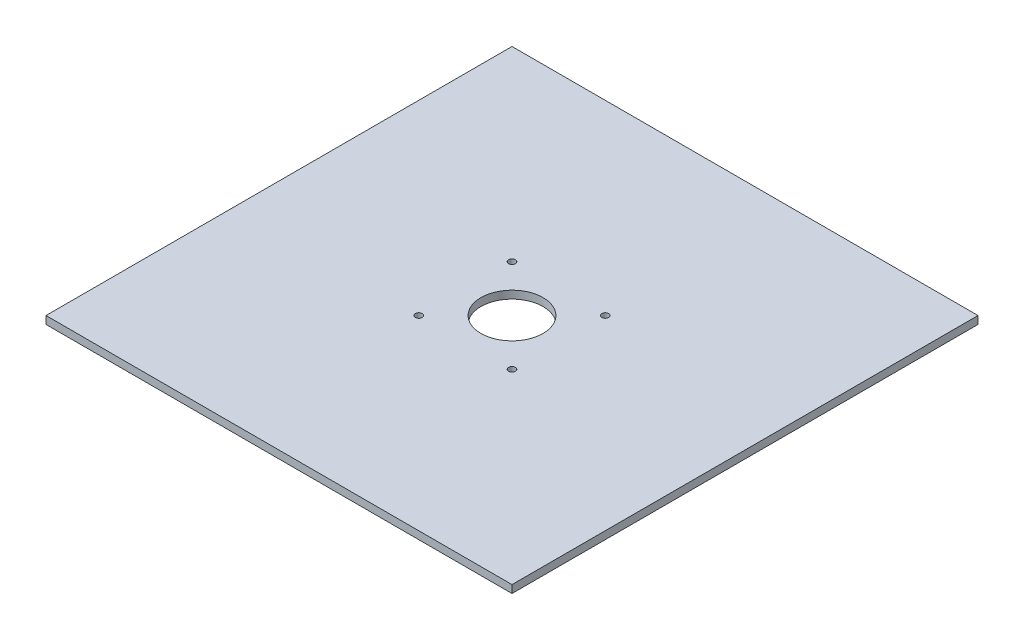
ISO-10303-21;
HEADER;
FILE_DESCRIPTION(('STEP AP214'),'2;1');
FILE_NAME('part.step','',(''),(''),'','','');
FILE_SCHEMA(('AUTOMOTIVE_DESIGN { 1 0 10303 214 1 1 1 1 }'));
ENDSEC;
DATA;
#1=APPLICATION_CONTEXT('core data for automotive mechanical design processes');
#2=APPLICATION_PROTOCOL_DEFINITION('international standard','automotive_design',2000,#1);
#3=PRODUCT_CONTEXT('',#1,'mechanical');
#4=PRODUCT('Part','Part','',(#3));
#5=PRODUCT_RELATED_PRODUCT_CATEGORY('part','',(#4));
#6=PRODUCT_DEFINITION_FORMATION('','',#4);
#7=PRODUCT_DEFINITION_CONTEXT('part definition',#1,'design');
#8=PRODUCT_DEFINITION('design','',#6,#7);
#9=PRODUCT_DEFINITION_SHAPE('','',#8);
#10=(LENGTH_UNIT() NAMED_UNIT(*) SI_UNIT(.MILLI.,.METRE.));
#11=(NAMED_UNIT(*) PLANE_ANGLE_UNIT() SI_UNIT($,.RADIAN.));
#12=(NAMED_UNIT(*) SI_UNIT($,.STERADIAN.) SOLID_ANGLE_UNIT());
#13=UNCERTAINTY_MEASURE_WITH_UNIT(LENGTH_MEASURE(1.E-05),#10,'distance_accuracy_value','');
#14=(GEOMETRIC_REPRESENTATION_CONTEXT(3) GLOBAL_UNCERTAINTY_ASSIGNED_CONTEXT((#13)) GLOBAL_UNIT_ASSIGNED_CONTEXT((#10,
#11,#12)) REPRESENTATION_CONTEXT('',''));
#15=CARTESIAN_POINT('',(0.,0.,0.));
#16=DIRECTION('',(0.,0.,1.));
#17=DIRECTION('',(1.,0.,0.));
#18=AXIS2_PLACEMENT_3D('',#15,#16,#17);
#19=CARTESIAN_POINT('',(0.,5.,0.));
#20=DIRECTION('',(0.,-1.,0.));
#21=DIRECTION('',(0.,0.,-1.));
#22=AXIS2_PLACEMENT_3D('',#19,#20,#21);
#23=PLANE('',#22);
#24=DIRECTION('',(0.,0.,-1.));
#25=VECTOR('',#24,1.);
#26=CARTESIAN_POINT('',(150.,5.,150.));
#27=LINE('',#26,#25);
#28=CARTESIAN_POINT('',(150.,5.,150.));
#29=VERTEX_POINT('',#28);
#30=CARTESIAN_POINT('',(150.,5.,-150.));
#31=VERTEX_POINT('',#30);
#32=EDGE_CURVE('E92',#29,#31,#27,.T.);
#33=ORIENTED_EDGE('',*,*,#32,.T.);
#34=DIRECTION('',(-1.,0.,0.));
#35=VECTOR('',#34,1.);
#36=CARTESIAN_POINT('',(-150.,5.,-150.));
#37=LINE('',#36,#35);
#38=CARTESIAN_POINT('',(-150.,5.,-150.));
#39=VERTEX_POINT('',#38);
#40=EDGE_CURVE('E87',#31,#39,#37,.T.);
#41=ORIENTED_EDGE('',*,*,#40,.T.);
#42=DIRECTION('',(0.,0.,1.));
#43=VECTOR('',#42,1.);
#44=CARTESIAN_POINT('',(-150.,5.,150.));
#45=LINE('',#44,#43);
#46=CARTESIAN_POINT('',(-150.,5.,150.));
#47=VERTEX_POINT('',#46);
#48=EDGE_CURVE('E90',#39,#47,#45,.T.);
#49=ORIENTED_EDGE('',*,*,#48,.T.);
#50=DIRECTION('',(1.,0.,0.));
#51=VECTOR('',#50,1.);
#52=CARTESIAN_POINT('',(-150.,5.,150.));
#53=LINE('',#52,#51);
#54=EDGE_CURVE('E57',#47,#29,#53,.T.);
#55=ORIENTED_EDGE('',*,*,#54,.T.);
#56=EDGE_LOOP('',(#33,#41,#49,#55));
#57=FACE_BOUND('',#56,.T.);
#58=CARTESIAN_POINT('',(0.,5.,0.));
#59=DIRECTION('',(0.,1.,0.));
#60=DIRECTION('',(0.,0.,1.));
#61=AXIS2_PLACEMENT_3D('',#58,#59,#60);
#62=CIRCLE('',#61,20.);
#63=CARTESIAN_POINT('',(0.,5.,20.));
#64=VERTEX_POINT('',#63);
#65=EDGE_CURVE('E112',#64,#64,#62,.T.);
#66=ORIENTED_EDGE('',*,*,#65,.F.);
#67=EDGE_LOOP('',(#66));
#68=FACE_BOUND('',#67,.T.);
#69=CARTESIAN_POINT('',(-30.,5.,-30.));
#70=DIRECTION('',(0.,1.,0.));
#71=DIRECTION('',(0.,0.,1.));
#72=AXIS2_PLACEMENT_3D('',#69,#70,#71);
#73=CIRCLE('',#72,2.2);
#74=CARTESIAN_POINT('',(-30.,5.,-27.8));
#75=VERTEX_POINT('',#74);
#76=EDGE_CURVE('E134',#75,#75,#73,.T.);
#77=ORIENTED_EDGE('',*,*,#76,.F.);
#78=EDGE_LOOP('',(#77));
#79=FACE_BOUND('',#78,.T.);
#80=CARTESIAN_POINT('',(30.,5.,-30.));
#81=DIRECTION('',(0.,1.,0.));
#82=DIRECTION('',(0.,0.,1.));
#83=AXIS2_PLACEMENT_3D('',#80,#81,#82);
#84=CIRCLE('',#83,2.2);
#85=CARTESIAN_POINT('',(30.,5.,-27.8));
#86=VERTEX_POINT('',#85);
#87=EDGE_CURVE('E142',#86,#86,#84,.T.);
#88=ORIENTED_EDGE('',*,*,#87,.F.);
#89=EDGE_LOOP('',(#88));
#90=FACE_BOUND('',#89,.T.);
#91=CARTESIAN_POINT('',(30.0000000000006,5.,30.));
#92=DIRECTION('',(0.,1.,0.));
#93=DIRECTION('',(0.,0.,1.));
#94=AXIS2_PLACEMENT_3D('',#91,#92,#93);
#95=CIRCLE('',#94,2.2);
#96=CARTESIAN_POINT('',(30.0000000000006,5.,32.2));
#97=VERTEX_POINT('',#96);
#98=EDGE_CURVE('E150',#97,#97,#95,.T.);
#99=ORIENTED_EDGE('',*,*,#98,.F.);
#100=EDGE_LOOP('',(#99));
#101=FACE_BOUND('',#100,.T.);
#102=CARTESIAN_POINT('',(-29.9999999999994,5.,30.));
#103=DIRECTION('',(0.,1.,0.));
#104=DIRECTION('',(0.,0.,1.));
#105=AXIS2_PLACEMENT_3D('',#102,#103,#104);
#106=CIRCLE('',#105,2.2);
#107=CARTESIAN_POINT('',(-29.9999999999994,5.,32.2));
#108=VERTEX_POINT('',#107);
#109=EDGE_CURVE('E158',#108,#108,#106,.T.);
#110=ORIENTED_EDGE('',*,*,#109,.F.);
#111=EDGE_LOOP('',(#110));
#112=FACE_BOUND('',#111,.T.);
#113=ADVANCED_FACE('F39',(#57,#68,#79,#90,#101,#112),#23,.F.);
#114=CARTESIAN_POINT('',(0.,0.,0.));
#115=DIRECTION('',(0.,-1.,0.));
#116=DIRECTION('',(0.,0.,-1.));
#117=AXIS2_PLACEMENT_3D('',#114,#115,#116);
#118=PLANE('',#117);
#119=CARTESIAN_POINT('',(30.0000000000006,0.,30.));
#120=DIRECTION('',(0.,1.,0.));
#121=DIRECTION('',(0.,0.,1.));
#122=AXIS2_PLACEMENT_3D('',#119,#120,#121);
#123=CIRCLE('',#122,2.2);
#124=CARTESIAN_POINT('',(30.0000000000006,0.,32.2));
#125=VERTEX_POINT('',#124);
#126=EDGE_CURVE('E154',#125,#125,#123,.T.);
#127=ORIENTED_EDGE('',*,*,#126,.T.);
#128=EDGE_LOOP('',(#127));
#129=FACE_BOUND('',#128,.T.);
#130=CARTESIAN_POINT('',(-30.,0.,-30.));
#131=DIRECTION('',(0.,1.,0.));
#132=DIRECTION('',(0.,0.,1.));
#133=AXIS2_PLACEMENT_3D('',#130,#131,#132);
#134=CIRCLE('',#133,2.2);
#135=CARTESIAN_POINT('',(-30.,0.,-27.8));
#136=VERTEX_POINT('',#135);
#137=EDGE_CURVE('E138',#136,#136,#134,.T.);
#138=ORIENTED_EDGE('',*,*,#137,.T.);
#139=EDGE_LOOP('',(#138));
#140=FACE_BOUND('',#139,.T.);
#141=DIRECTION('',(0.,0.,-1.));
#142=VECTOR('',#141,1.);
#143=CARTESIAN_POINT('',(150.,0.,150.));
#144=LINE('',#143,#142);
#145=CARTESIAN_POINT('',(150.,0.,150.));
#146=VERTEX_POINT('',#145);
#147=CARTESIAN_POINT('',(150.,0.,-150.));
#148=VERTEX_POINT('',#147);
#149=EDGE_CURVE('E108',#146,#148,#144,.T.);
#150=ORIENTED_EDGE('',*,*,#149,.F.);
#151=DIRECTION('',(1.,0.,0.));
#152=VECTOR('',#151,1.);
#153=CARTESIAN_POINT('',(-150.,0.,150.));
#154=LINE('',#153,#152);
#155=CARTESIAN_POINT('',(-150.,0.,150.));
#156=VERTEX_POINT('',#155);
#157=EDGE_CURVE('E80',#156,#146,#154,.T.);
#158=ORIENTED_EDGE('',*,*,#157,.F.);
#159=DIRECTION('',(0.,0.,1.));
#160=VECTOR('',#159,1.);
#161=CARTESIAN_POINT('',(-150.,0.,150.));
#162=LINE('',#161,#160);
#163=CARTESIAN_POINT('',(-150.,0.,-150.));
#164=VERTEX_POINT('',#163);
#165=EDGE_CURVE('E74',#164,#156,#162,.T.);
#166=ORIENTED_EDGE('',*,*,#165,.F.);
#167=DIRECTION('',(-1.,0.,0.));
#168=VECTOR('',#167,1.);
#169=CARTESIAN_POINT('',(-150.,0.,-150.));
#170=LINE('',#169,#168);
#171=EDGE_CURVE('E97',#148,#164,#170,.T.);
#172=ORIENTED_EDGE('',*,*,#171,.F.);
#173=EDGE_LOOP('',(#150,#158,#166,#172));
#174=FACE_BOUND('',#173,.T.);
#175=CARTESIAN_POINT('',(0.,0.,0.));
#176=DIRECTION('',(0.,1.,0.));
#177=DIRECTION('',(0.,0.,1.));
#178=AXIS2_PLACEMENT_3D('',#175,#176,#177);
#179=CIRCLE('',#178,20.);
#180=CARTESIAN_POINT('',(0.,0.,20.));
#181=VERTEX_POINT('',#180);
#182=EDGE_CURVE('E130',#181,#181,#179,.T.);
#183=ORIENTED_EDGE('',*,*,#182,.T.);
#184=EDGE_LOOP('',(#183));
#185=FACE_BOUND('',#184,.T.);
#186=CARTESIAN_POINT('',(30.,0.,-30.));
#187=DIRECTION('',(0.,1.,0.));
#188=DIRECTION('',(0.,0.,1.));
#189=AXIS2_PLACEMENT_3D('',#186,#187,#188);
#190=CIRCLE('',#189,2.2);
#191=CARTESIAN_POINT('',(30.,0.,-27.8));
#192=VERTEX_POINT('',#191);
#193=EDGE_CURVE('E146',#192,#192,#190,.T.);
#194=ORIENTED_EDGE('',*,*,#193,.T.);
#195=EDGE_LOOP('',(#194));
#196=FACE_BOUND('',#195,.T.);
#197=CARTESIAN_POINT('',(-29.9999999999994,0.,30.));
#198=DIRECTION('',(0.,1.,0.));
#199=DIRECTION('',(0.,0.,1.));
#200=AXIS2_PLACEMENT_3D('',#197,#198,#199);
#201=CIRCLE('',#200,2.2);
#202=CARTESIAN_POINT('',(-29.9999999999994,0.,32.2));
#203=VERTEX_POINT('',#202);
#204=EDGE_CURVE('E162',#203,#203,#201,.T.);
#205=ORIENTED_EDGE('',*,*,#204,.T.);
#206=EDGE_LOOP('',(#205));
#207=FACE_BOUND('',#206,.T.);
#208=ADVANCED_FACE('F125',(#129,#140,#174,#185,#196,#207),#118,.T.);
#209=CARTESIAN_POINT('',(150.,5.,150.));
#210=DIRECTION('',(-1.,0.,0.));
#211=DIRECTION('',(0.,0.,1.));
#212=AXIS2_PLACEMENT_3D('',#209,#210,#211);
#213=PLANE('',#212);
#214=ORIENTED_EDGE('',*,*,#149,.T.);
#215=DIRECTION('',(0.,-1.,0.));
#216=VECTOR('',#215,1.);
#217=CARTESIAN_POINT('',(150.,5.,-150.));
#218=LINE('',#217,#216);
#219=EDGE_CURVE('E11',#31,#148,#218,.T.);
#220=ORIENTED_EDGE('',*,*,#219,.F.);
#221=ORIENTED_EDGE('',*,*,#32,.F.);
#222=DIRECTION('',(0.,-1.,0.));
#223=VECTOR('',#222,1.);
#224=CARTESIAN_POINT('',(150.,5.,150.));
#225=LINE('',#224,#223);
#226=EDGE_CURVE('E104',#29,#146,#225,.T.);
#227=ORIENTED_EDGE('',*,*,#226,.T.);
#228=EDGE_LOOP('',(#214,#220,#221,#227));
#229=FACE_BOUND('',#228,.T.);
#230=ADVANCED_FACE('F41',(#229),#213,.F.);
#231=CARTESIAN_POINT('',(-150.,5.,-150.));
#232=DIRECTION('',(0.,0.,1.));
#233=DIRECTION('',(1.,0.,0.));
#234=AXIS2_PLACEMENT_3D('',#231,#232,#233);
#235=PLANE('',#234);
#236=ORIENTED_EDGE('',*,*,#171,.T.);
#237=DIRECTION('',(0.,-1.,0.));
#238=VECTOR('',#237,1.);
#239=CARTESIAN_POINT('',(-150.,5.,-150.));
#240=LINE('',#239,#238);
#241=EDGE_CURVE('E49',#39,#164,#240,.T.);
#242=ORIENTED_EDGE('',*,*,#241,.F.);
#243=ORIENTED_EDGE('',*,*,#40,.F.);
#244=ORIENTED_EDGE('',*,*,#219,.T.);
#245=EDGE_LOOP('',(#236,#242,#243,#244));
#246=FACE_BOUND('',#245,.T.);
#247=ADVANCED_FACE('F96',(#246),#235,.F.);
#248=CARTESIAN_POINT('',(-150.,5.,150.));
#249=DIRECTION('',(1.,0.,0.));
#250=DIRECTION('',(0.,0.,-1.));
#251=AXIS2_PLACEMENT_3D('',#248,#249,#250);
#252=PLANE('',#251);
#253=ORIENTED_EDGE('',*,*,#165,.T.);
#254=DIRECTION('',(0.,-1.,0.));
#255=VECTOR('',#254,1.);
#256=CARTESIAN_POINT('',(-150.,5.,150.));
#257=LINE('',#256,#255);
#258=EDGE_CURVE('E99',#47,#156,#257,.T.);
#259=ORIENTED_EDGE('',*,*,#258,.F.);
#260=ORIENTED_EDGE('',*,*,#48,.F.);
#261=ORIENTED_EDGE('',*,*,#241,.T.);
#262=EDGE_LOOP('',(#253,#259,#260,#261));
#263=FACE_BOUND('',#262,.T.);
#264=ADVANCED_FACE('F100',(#263),#252,.F.);
#265=CARTESIAN_POINT('',(-150.,5.,150.));
#266=DIRECTION('',(0.,0.,-1.));
#267=DIRECTION('',(-1.,0.,0.));
#268=AXIS2_PLACEMENT_3D('',#265,#266,#267);
#269=PLANE('',#268);
#270=ORIENTED_EDGE('',*,*,#157,.T.);
#271=ORIENTED_EDGE('',*,*,#226,.F.);
#272=ORIENTED_EDGE('',*,*,#54,.F.);
#273=ORIENTED_EDGE('',*,*,#258,.T.);
#274=EDGE_LOOP('',(#270,#271,#272,#273));
#275=FACE_BOUND('',#274,.T.);
#276=ADVANCED_FACE('F122',(#275),#269,.F.);
#277=CARTESIAN_POINT('',(0.,5.,0.));
#278=DIRECTION('',(0.,-1.,0.));
#279=DIRECTION('',(0.,0.,-1.));
#280=AXIS2_PLACEMENT_3D('',#277,#278,#279);
#281=CYLINDRICAL_SURFACE('',#280,20.);
#282=ORIENTED_EDGE('',*,*,#65,.T.);
#283=EDGE_LOOP('',(#282));
#284=FACE_BOUND('',#283,.T.);
#285=ORIENTED_EDGE('',*,*,#182,.F.);
#286=EDGE_LOOP('',(#285));
#287=FACE_BOUND('',#286,.T.);
#288=ADVANCED_FACE('F181',(#284,#287),#281,.F.);
#289=CARTESIAN_POINT('',(-30.,5.,-30.));
#290=DIRECTION('',(0.,-1.,0.));
#291=DIRECTION('',(0.,0.,-1.));
#292=AXIS2_PLACEMENT_3D('',#289,#290,#291);
#293=CYLINDRICAL_SURFACE('',#292,2.2);
#294=ORIENTED_EDGE('',*,*,#76,.T.);
#295=EDGE_LOOP('',(#294));
#296=FACE_BOUND('',#295,.T.);
#297=ORIENTED_EDGE('',*,*,#137,.F.);
#298=EDGE_LOOP('',(#297));
#299=FACE_BOUND('',#298,.T.);
#300=ADVANCED_FACE('F227',(#296,#299),#293,.F.);
#301=CARTESIAN_POINT('',(30.,5.,-30.));
#302=DIRECTION('',(0.,-1.,0.));
#303=DIRECTION('',(0.,0.,-1.));
#304=AXIS2_PLACEMENT_3D('',#301,#302,#303);
#305=CYLINDRICAL_SURFACE('',#304,2.2);
#306=ORIENTED_EDGE('',*,*,#87,.T.);
#307=EDGE_LOOP('',(#306));
#308=FACE_BOUND('',#307,.T.);
#309=ORIENTED_EDGE('',*,*,#193,.F.);
#310=EDGE_LOOP('',(#309));
#311=FACE_BOUND('',#310,.T.);
#312=ADVANCED_FACE('F235',(#308,#311),#305,.F.);
#313=CARTESIAN_POINT('',(30.0000000000006,5.,30.));
#314=DIRECTION('',(0.,-1.,0.));
#315=DIRECTION('',(0.,0.,-1.));
#316=AXIS2_PLACEMENT_3D('',#313,#314,#315);
#317=CYLINDRICAL_SURFACE('',#316,2.2);
#318=ORIENTED_EDGE('',*,*,#98,.T.);
#319=EDGE_LOOP('',(#318));
#320=FACE_BOUND('',#319,.T.);
#321=ORIENTED_EDGE('',*,*,#126,.F.);
#322=EDGE_LOOP('',(#321));
#323=FACE_BOUND('',#322,.T.);
#324=ADVANCED_FACE('F243',(#320,#323),#317,.F.);
#325=CARTESIAN_POINT('',(-29.9999999999994,5.,30.));
#326=DIRECTION('',(0.,-1.,0.));
#327=DIRECTION('',(0.,0.,-1.));
#328=AXIS2_PLACEMENT_3D('',#325,#326,#327);
#329=CYLINDRICAL_SURFACE('',#328,2.2);
#330=ORIENTED_EDGE('',*,*,#109,.T.);
#331=EDGE_LOOP('',(#330));
#332=FACE_BOUND('',#331,.T.);
#333=ORIENTED_EDGE('',*,*,#204,.F.);
#334=EDGE_LOOP('',(#333));
#335=FACE_BOUND('',#334,.T.);
#336=ADVANCED_FACE('F170',(#332,#335),#329,.F.);
#337=CLOSED_SHELL('',(#113,#208,#230,#247,#264,#276,#288,#300,#312,#324,#336));
#338=MANIFOLD_SOLID_BREP('B2',#337);
#339=ADVANCED_BREP_SHAPE_REPRESENTATION('',(#18,#338),#14);
#340=SHAPE_DEFINITION_REPRESENTATION(#9,#339);
ENDSEC;
END-ISO-10303-21;
